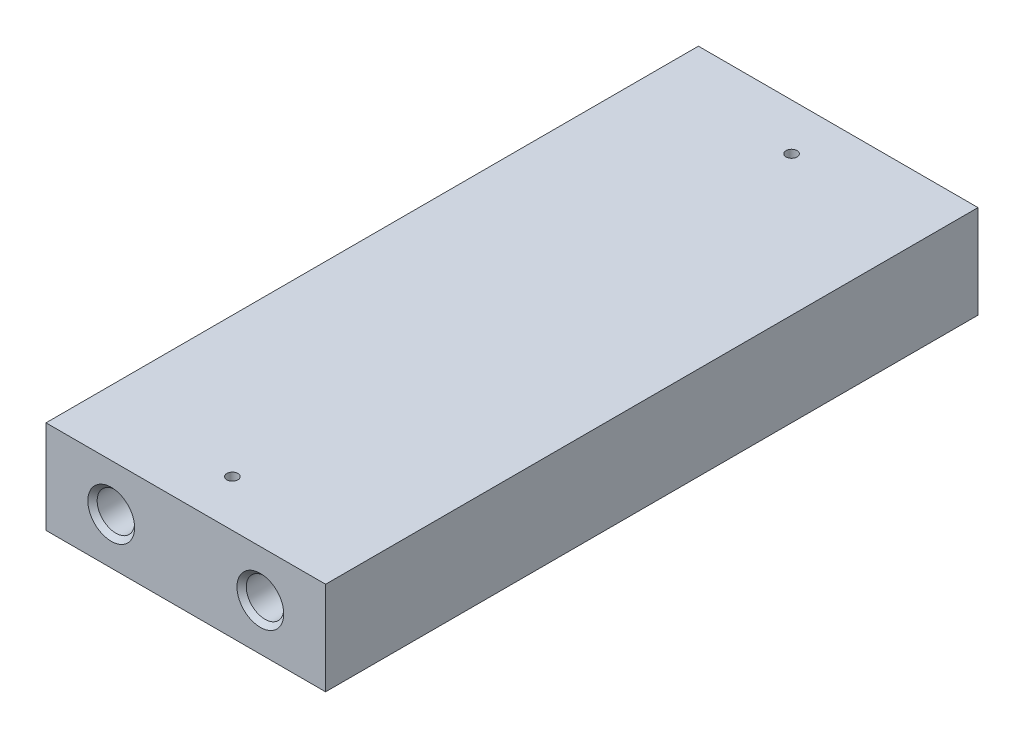
ISO-10303-21;
HEADER;
FILE_DESCRIPTION(('STEP AP214'),'2;1');
FILE_NAME('part.step','',(''),(''),'','','');
FILE_SCHEMA(('AUTOMOTIVE_DESIGN { 1 0 10303 214 1 1 1 1 }'));
ENDSEC;
DATA;
#1=APPLICATION_CONTEXT('core data for automotive mechanical design processes');
#2=APPLICATION_PROTOCOL_DEFINITION('international standard','automotive_design',2000,#1);
#3=PRODUCT_CONTEXT('',#1,'mechanical');
#4=PRODUCT('Part','Part','',(#3));
#5=PRODUCT_RELATED_PRODUCT_CATEGORY('part','',(#4));
#6=PRODUCT_DEFINITION_FORMATION('','',#4);
#7=PRODUCT_DEFINITION_CONTEXT('part definition',#1,'design');
#8=PRODUCT_DEFINITION('design','',#6,#7);
#9=PRODUCT_DEFINITION_SHAPE('','',#8);
#10=(LENGTH_UNIT() NAMED_UNIT(*) SI_UNIT(.MILLI.,.METRE.));
#11=(NAMED_UNIT(*) PLANE_ANGLE_UNIT() SI_UNIT($,.RADIAN.));
#12=(NAMED_UNIT(*) SI_UNIT($,.STERADIAN.) SOLID_ANGLE_UNIT());
#13=UNCERTAINTY_MEASURE_WITH_UNIT(LENGTH_MEASURE(1.E-05),#10,'distance_accuracy_value','');
#14=(GEOMETRIC_REPRESENTATION_CONTEXT(3) GLOBAL_UNCERTAINTY_ASSIGNED_CONTEXT((#13)) GLOBAL_UNIT_ASSIGNED_CONTEXT((#10,
#11,#12)) REPRESENTATION_CONTEXT('',''));
#15=CARTESIAN_POINT('',(0.,0.,0.));
#16=DIRECTION('',(0.,0.,1.));
#17=DIRECTION('',(1.,0.,0.));
#18=AXIS2_PLACEMENT_3D('',#15,#16,#17);
#19=CARTESIAN_POINT('',(19.05,-6.35,-88.9));
#20=DIRECTION('',(1.,0.,0.));
#21=DIRECTION('',(0.,0.,-1.));
#22=AXIS2_PLACEMENT_3D('',#19,#20,#21);
#23=PLANE('',#22);
#24=DIRECTION('',(0.,1.,0.));
#25=VECTOR('',#24,1.);
#26=CARTESIAN_POINT('',(19.05,-6.35,0.));
#27=LINE('',#26,#25);
#28=CARTESIAN_POINT('',(19.05,-6.35,0.));
#29=VERTEX_POINT('',#28);
#30=CARTESIAN_POINT('',(19.05,6.35,0.));
#31=VERTEX_POINT('',#30);
#32=EDGE_CURVE('E190',#29,#31,#27,.T.);
#33=ORIENTED_EDGE('',*,*,#32,.F.);
#34=DIRECTION('',(0.,0.,1.));
#35=VECTOR('',#34,1.);
#36=CARTESIAN_POINT('',(19.05,-6.35,-88.9));
#37=LINE('',#36,#35);
#38=CARTESIAN_POINT('',(19.05,-6.35,-88.9));
#39=VERTEX_POINT('',#38);
#40=EDGE_CURVE('E13',#39,#29,#37,.T.);
#41=ORIENTED_EDGE('',*,*,#40,.F.);
#42=DIRECTION('',(0.,1.,0.));
#43=VECTOR('',#42,1.);
#44=CARTESIAN_POINT('',(19.05,-6.35,-88.9));
#45=LINE('',#44,#43);
#46=CARTESIAN_POINT('',(19.05,6.35,-88.9));
#47=VERTEX_POINT('',#46);
#48=EDGE_CURVE('E191',#39,#47,#45,.T.);
#49=ORIENTED_EDGE('',*,*,#48,.T.);
#50=DIRECTION('',(0.,0.,1.));
#51=VECTOR('',#50,1.);
#52=CARTESIAN_POINT('',(19.05,6.35,-88.9));
#53=LINE('',#52,#51);
#54=EDGE_CURVE('E55',#47,#31,#53,.T.);
#55=ORIENTED_EDGE('',*,*,#54,.T.);
#56=EDGE_LOOP('',(#33,#41,#49,#55));
#57=FACE_BOUND('',#56,.T.);
#58=ADVANCED_FACE('F52',(#57),#23,.T.);
#59=CARTESIAN_POINT('',(-19.05,-6.35,-88.9));
#60=DIRECTION('',(0.,-1.,0.));
#61=DIRECTION('',(0.,0.,-1.));
#62=AXIS2_PLACEMENT_3D('',#59,#60,#61);
#63=PLANE('',#62);
#64=CARTESIAN_POINT('',(3.44169137633799E-12,-6.35,-82.55));
#65=DIRECTION('',(0.,1.,0.));
#66=DIRECTION('',(0.,0.,1.));
#67=AXIS2_PLACEMENT_3D('',#64,#65,#66);
#68=CIRCLE('',#67,0.755649999999997);
#69=CARTESIAN_POINT('',(3.44169137633799E-12,-6.35,-81.79435));
#70=VERTEX_POINT('',#69);
#71=EDGE_CURVE('E145',#70,#70,#68,.T.);
#72=ORIENTED_EDGE('',*,*,#71,.T.);
#73=EDGE_LOOP('',(#72));
#74=FACE_BOUND('',#73,.T.);
#75=CARTESIAN_POINT('',(3.44169137633799E-12,-6.35,-6.34999999999999));
#76=DIRECTION('',(0.,1.,0.));
#77=DIRECTION('',(0.,0.,1.));
#78=AXIS2_PLACEMENT_3D('',#75,#76,#77);
#79=CIRCLE('',#78,0.755649999999997);
#80=CARTESIAN_POINT('',(3.44169137633799E-12,-6.35,-5.59435));
#81=VERTEX_POINT('',#80);
#82=EDGE_CURVE('E151',#81,#81,#79,.T.);
#83=ORIENTED_EDGE('',*,*,#82,.T.);
#84=EDGE_LOOP('',(#83));
#85=FACE_BOUND('',#84,.T.);
#86=DIRECTION('',(1.,0.,0.));
#87=VECTOR('',#86,1.);
#88=CARTESIAN_POINT('',(-19.05,-6.35,0.));
#89=LINE('',#88,#87);
#90=CARTESIAN_POINT('',(-19.05,-6.35,0.));
#91=VERTEX_POINT('',#90);
#92=EDGE_CURVE('E194',#91,#29,#89,.T.);
#93=ORIENTED_EDGE('',*,*,#92,.F.);
#94=DIRECTION('',(0.,0.,1.));
#95=VECTOR('',#94,1.);
#96=CARTESIAN_POINT('',(-19.05,-6.35,-88.9));
#97=LINE('',#96,#95);
#98=CARTESIAN_POINT('',(-19.05,-6.35,-88.9));
#99=VERTEX_POINT('',#98);
#100=EDGE_CURVE('E61',#99,#91,#97,.T.);
#101=ORIENTED_EDGE('',*,*,#100,.F.);
#102=DIRECTION('',(1.,0.,0.));
#103=VECTOR('',#102,1.);
#104=CARTESIAN_POINT('',(-19.05,-6.35,-88.9));
#105=LINE('',#104,#103);
#106=EDGE_CURVE('E198',#99,#39,#105,.T.);
#107=ORIENTED_EDGE('',*,*,#106,.T.);
#108=ORIENTED_EDGE('',*,*,#40,.T.);
#109=EDGE_LOOP('',(#93,#101,#107,#108));
#110=FACE_BOUND('',#109,.T.);
#111=ADVANCED_FACE('F213',(#74,#85,#110),#63,.T.);
#112=CARTESIAN_POINT('',(-19.05,-6.35,-88.9));
#113=DIRECTION('',(-1.,0.,0.));
#114=DIRECTION('',(0.,0.,1.));
#115=AXIS2_PLACEMENT_3D('',#112,#113,#114);
#116=PLANE('',#115);
#117=CARTESIAN_POINT('',(-19.05,0.,-69.85));
#118=DIRECTION('',(-1.,0.,0.));
#119=DIRECTION('',(0.,0.,1.));
#120=AXIS2_PLACEMENT_3D('',#117,#118,#119);
#121=CIRCLE('',#120,3.1877);
#122=CARTESIAN_POINT('',(-19.05,0.,-66.6623));
#123=VERTEX_POINT('',#122);
#124=EDGE_CURVE('E133',#123,#123,#121,.T.);
#125=ORIENTED_EDGE('',*,*,#124,.F.);
#126=EDGE_LOOP('',(#125));
#127=FACE_BOUND('',#126,.T.);
#128=CARTESIAN_POINT('',(-19.05,0.,-19.05));
#129=DIRECTION('',(-1.,0.,0.));
#130=DIRECTION('',(0.,0.,1.));
#131=AXIS2_PLACEMENT_3D('',#128,#129,#130);
#132=CIRCLE('',#131,3.1877);
#133=CARTESIAN_POINT('',(-19.05,0.,-15.8623));
#134=VERTEX_POINT('',#133);
#135=EDGE_CURVE('E126',#134,#134,#132,.T.);
#136=ORIENTED_EDGE('',*,*,#135,.F.);
#137=EDGE_LOOP('',(#136));
#138=FACE_BOUND('',#137,.T.);
#139=DIRECTION('',(0.,-1.,0.));
#140=VECTOR('',#139,1.);
#141=CARTESIAN_POINT('',(-19.05,-6.35,0.));
#142=LINE('',#141,#140);
#143=CARTESIAN_POINT('',(-19.05,6.35,0.));
#144=VERTEX_POINT('',#143);
#145=EDGE_CURVE('E205',#144,#91,#142,.T.);
#146=ORIENTED_EDGE('',*,*,#145,.F.);
#147=DIRECTION('',(0.,0.,1.));
#148=VECTOR('',#147,1.);
#149=CARTESIAN_POINT('',(-19.05,6.35,-88.9));
#150=LINE('',#149,#148);
#151=CARTESIAN_POINT('',(-19.05,6.35,-88.9));
#152=VERTEX_POINT('',#151);
#153=EDGE_CURVE('E209',#152,#144,#150,.T.);
#154=ORIENTED_EDGE('',*,*,#153,.F.);
#155=DIRECTION('',(0.,-1.,0.));
#156=VECTOR('',#155,1.);
#157=CARTESIAN_POINT('',(-19.05,-6.35,-88.9));
#158=LINE('',#157,#156);
#159=EDGE_CURVE('E196',#152,#99,#158,.T.);
#160=ORIENTED_EDGE('',*,*,#159,.T.);
#161=ORIENTED_EDGE('',*,*,#100,.T.);
#162=EDGE_LOOP('',(#146,#154,#160,#161));
#163=FACE_BOUND('',#162,.T.);
#164=ADVANCED_FACE('F216',(#127,#138,#163),#116,.T.);
#165=CARTESIAN_POINT('',(-19.05,6.35,-88.9));
#166=DIRECTION('',(0.,1.,0.));
#167=DIRECTION('',(0.,0.,1.));
#168=AXIS2_PLACEMENT_3D('',#165,#166,#167);
#169=PLANE('',#168);
#170=CARTESIAN_POINT('',(3.44169137633799E-12,6.35,-82.55));
#171=DIRECTION('',(0.,1.,0.));
#172=DIRECTION('',(0.,0.,1.));
#173=AXIS2_PLACEMENT_3D('',#170,#171,#172);
#174=CIRCLE('',#173,0.755649999999998);
#175=CARTESIAN_POINT('',(3.44169137633799E-12,6.35,-81.79435));
#176=VERTEX_POINT('',#175);
#177=EDGE_CURVE('E142',#176,#176,#174,.T.);
#178=ORIENTED_EDGE('',*,*,#177,.F.);
#179=EDGE_LOOP('',(#178));
#180=FACE_BOUND('',#179,.T.);
#181=CARTESIAN_POINT('',(3.44169137633799E-12,6.35,-6.34999999999999));
#182=DIRECTION('',(0.,1.,0.));
#183=DIRECTION('',(0.,0.,1.));
#184=AXIS2_PLACEMENT_3D('',#181,#182,#183);
#185=CIRCLE('',#184,0.755649999999998);
#186=CARTESIAN_POINT('',(3.44169137633799E-12,6.35,-5.59435));
#187=VERTEX_POINT('',#186);
#188=EDGE_CURVE('E148',#187,#187,#185,.T.);
#189=ORIENTED_EDGE('',*,*,#188,.F.);
#190=EDGE_LOOP('',(#189));
#191=FACE_BOUND('',#190,.T.);
#192=DIRECTION('',(-1.,0.,0.));
#193=VECTOR('',#192,1.);
#194=CARTESIAN_POINT('',(-19.05,6.35,0.));
#195=LINE('',#194,#193);
#196=EDGE_CURVE('E202',#31,#144,#195,.T.);
#197=ORIENTED_EDGE('',*,*,#196,.F.);
#198=ORIENTED_EDGE('',*,*,#54,.F.);
#199=DIRECTION('',(-1.,0.,0.));
#200=VECTOR('',#199,1.);
#201=CARTESIAN_POINT('',(-19.05,6.35,-88.9));
#202=LINE('',#201,#200);
#203=EDGE_CURVE('E193',#47,#152,#202,.T.);
#204=ORIENTED_EDGE('',*,*,#203,.T.);
#205=ORIENTED_EDGE('',*,*,#153,.T.);
#206=EDGE_LOOP('',(#197,#198,#204,#205));
#207=FACE_BOUND('',#206,.T.);
#208=ADVANCED_FACE('F210',(#180,#191,#207),#169,.T.);
#209=CARTESIAN_POINT('',(0.,0.,-88.9));
#210=DIRECTION('',(0.,0.,-1.));
#211=DIRECTION('',(-1.,0.,0.));
#212=AXIS2_PLACEMENT_3D('',#209,#210,#211);
#213=PLANE('',#212);
#214=CARTESIAN_POINT('',(-10.1599999999965,0.,-88.9));
#215=DIRECTION('',(0.,0.,-1.));
#216=DIRECTION('',(-1.,0.,0.));
#217=AXIS2_PLACEMENT_3D('',#214,#215,#216);
#218=CIRCLE('',#217,3.1877);
#219=CARTESIAN_POINT('',(-13.3476999999965,0.,-88.9));
#220=VERTEX_POINT('',#219);
#221=EDGE_CURVE('E154',#220,#220,#218,.T.);
#222=ORIENTED_EDGE('',*,*,#221,.F.);
#223=EDGE_LOOP('',(#222));
#224=FACE_BOUND('',#223,.T.);
#225=CARTESIAN_POINT('',(10.1600000000035,0.,-88.9));
#226=DIRECTION('',(0.,0.,-1.));
#227=DIRECTION('',(-1.,0.,0.));
#228=AXIS2_PLACEMENT_3D('',#225,#226,#227);
#229=CIRCLE('',#228,3.1877);
#230=CARTESIAN_POINT('',(6.97230000000349,0.,-88.9));
#231=VERTEX_POINT('',#230);
#232=EDGE_CURVE('E163',#231,#231,#229,.T.);
#233=ORIENTED_EDGE('',*,*,#232,.F.);
#234=EDGE_LOOP('',(#233));
#235=FACE_BOUND('',#234,.T.);
#236=ORIENTED_EDGE('',*,*,#48,.F.);
#237=ORIENTED_EDGE('',*,*,#106,.F.);
#238=ORIENTED_EDGE('',*,*,#159,.F.);
#239=ORIENTED_EDGE('',*,*,#203,.F.);
#240=EDGE_LOOP('',(#236,#237,#238,#239));
#241=FACE_BOUND('',#240,.T.);
#242=ADVANCED_FACE('F218',(#224,#235,#241),#213,.T.);
#243=CARTESIAN_POINT('',(0.,0.,0.));
#244=DIRECTION('',(0.,0.,-1.));
#245=DIRECTION('',(-1.,0.,0.));
#246=AXIS2_PLACEMENT_3D('',#243,#244,#245);
#247=PLANE('',#246);
#248=CARTESIAN_POINT('',(-10.1599999999965,0.,0.));
#249=DIRECTION('',(0.,0.,1.));
#250=DIRECTION('',(1.,0.,0.));
#251=AXIS2_PLACEMENT_3D('',#248,#249,#250);
#252=CIRCLE('',#251,3.1877);
#253=CARTESIAN_POINT('',(-6.97229999999651,0.,0.));
#254=VERTEX_POINT('',#253);
#255=EDGE_CURVE('E172',#254,#254,#252,.T.);
#256=ORIENTED_EDGE('',*,*,#255,.F.);
#257=EDGE_LOOP('',(#256));
#258=FACE_BOUND('',#257,.T.);
#259=CARTESIAN_POINT('',(10.1600000000035,0.,0.));
#260=DIRECTION('',(0.,0.,1.));
#261=DIRECTION('',(1.,0.,0.));
#262=AXIS2_PLACEMENT_3D('',#259,#260,#261);
#263=CIRCLE('',#262,3.1877);
#264=CARTESIAN_POINT('',(13.3477000000035,0.,0.));
#265=VERTEX_POINT('',#264);
#266=EDGE_CURVE('E181',#265,#265,#263,.T.);
#267=ORIENTED_EDGE('',*,*,#266,.F.);
#268=EDGE_LOOP('',(#267));
#269=FACE_BOUND('',#268,.T.);
#270=ORIENTED_EDGE('',*,*,#32,.T.);
#271=ORIENTED_EDGE('',*,*,#196,.T.);
#272=ORIENTED_EDGE('',*,*,#145,.T.);
#273=ORIENTED_EDGE('',*,*,#92,.T.);
#274=EDGE_LOOP('',(#270,#271,#272,#273));
#275=FACE_BOUND('',#274,.T.);
#276=ADVANCED_FACE('F212',(#258,#269,#275),#247,.F.);
#277=CARTESIAN_POINT('',(10.1600000000035,0.,-12.7));
#278=DIRECTION('',(0.,0.,1.));
#279=DIRECTION('',(1.,0.,0.));
#280=AXIS2_PLACEMENT_3D('',#277,#278,#279);
#281=CONICAL_SURFACE('',#280,2.5527,1.02974425867665);
#282=CARTESIAN_POINT('',(10.1600000000035,0.,-14.2338169021917));
#283=VERTEX_POINT('',#282);
#284=VERTEX_LOOP('',#283);
#285=FACE_BOUND('',#284,.T.);
#286=CARTESIAN_POINT('',(10.1600000000035,0.,-12.7));
#287=DIRECTION('',(0.,0.,1.));
#288=DIRECTION('',(1.,0.,0.));
#289=AXIS2_PLACEMENT_3D('',#286,#287,#288);
#290=CIRCLE('',#289,2.5527);
#291=CARTESIAN_POINT('',(12.7127000000035,0.,-12.7));
#292=VERTEX_POINT('',#291);
#293=EDGE_CURVE('E187',#292,#292,#290,.T.);
#294=ORIENTED_EDGE('',*,*,#293,.T.);
#295=EDGE_LOOP('',(#294));
#296=FACE_BOUND('',#295,.T.);
#297=ADVANCED_FACE('F226',(#285,#296),#281,.F.);
#298=CARTESIAN_POINT('',(10.1600000000035,0.,0.));
#299=DIRECTION('',(0.,0.,1.));
#300=DIRECTION('',(1.,0.,0.));
#301=AXIS2_PLACEMENT_3D('',#298,#299,#300);
#302=CYLINDRICAL_SURFACE('',#301,2.5527);
#303=ORIENTED_EDGE('',*,*,#293,.F.);
#304=EDGE_LOOP('',(#303));
#305=FACE_BOUND('',#304,.T.);
#306=CARTESIAN_POINT('',(10.1600000000035,0.,-0.635000000000004));
#307=DIRECTION('',(0.,0.,1.));
#308=DIRECTION('',(1.,0.,0.));
#309=AXIS2_PLACEMENT_3D('',#306,#307,#308);
#310=CIRCLE('',#309,2.5527);
#311=CARTESIAN_POINT('',(12.7127000000035,0.,-0.635000000000004));
#312=VERTEX_POINT('',#311);
#313=EDGE_CURVE('E184',#312,#312,#310,.T.);
#314=ORIENTED_EDGE('',*,*,#313,.T.);
#315=EDGE_LOOP('',(#314));
#316=FACE_BOUND('',#315,.T.);
#317=ADVANCED_FACE('F302',(#305,#316),#302,.F.);
#318=CARTESIAN_POINT('',(10.1600000000035,0.,0.));
#319=DIRECTION('',(0.,0.,1.));
#320=DIRECTION('',(1.,0.,0.));
#321=AXIS2_PLACEMENT_3D('',#318,#319,#320);
#322=CONICAL_SURFACE('',#321,3.1877,0.785398163397446);
#323=ORIENTED_EDGE('',*,*,#313,.F.);
#324=EDGE_LOOP('',(#323));
#325=FACE_BOUND('',#324,.T.);
#326=ORIENTED_EDGE('',*,*,#266,.T.);
#327=EDGE_LOOP('',(#326));
#328=FACE_BOUND('',#327,.T.);
#329=ADVANCED_FACE('F298',(#325,#328),#322,.F.);
#330=CARTESIAN_POINT('',(-10.1599999999965,0.,-12.7));
#331=DIRECTION('',(0.,0.,1.));
#332=DIRECTION('',(1.,0.,0.));
#333=AXIS2_PLACEMENT_3D('',#330,#331,#332);
#334=CONICAL_SURFACE('',#333,2.5527,1.02974425867665);
#335=CARTESIAN_POINT('',(-10.1599999999965,0.,-14.2338169021917));
#336=VERTEX_POINT('',#335);
#337=VERTEX_LOOP('',#336);
#338=FACE_BOUND('',#337,.T.);
#339=CARTESIAN_POINT('',(-10.1599999999965,0.,-12.7));
#340=DIRECTION('',(0.,0.,1.));
#341=DIRECTION('',(1.,0.,0.));
#342=AXIS2_PLACEMENT_3D('',#339,#340,#341);
#343=CIRCLE('',#342,2.5527);
#344=CARTESIAN_POINT('',(-7.60729999999651,0.,-12.7));
#345=VERTEX_POINT('',#344);
#346=EDGE_CURVE('E178',#345,#345,#343,.T.);
#347=ORIENTED_EDGE('',*,*,#346,.T.);
#348=EDGE_LOOP('',(#347));
#349=FACE_BOUND('',#348,.T.);
#350=ADVANCED_FACE('F294',(#338,#349),#334,.F.);
#351=CARTESIAN_POINT('',(-10.1599999999965,0.,0.));
#352=DIRECTION('',(0.,0.,1.));
#353=DIRECTION('',(1.,0.,0.));
#354=AXIS2_PLACEMENT_3D('',#351,#352,#353);
#355=CYLINDRICAL_SURFACE('',#354,2.5527);
#356=ORIENTED_EDGE('',*,*,#346,.F.);
#357=EDGE_LOOP('',(#356));
#358=FACE_BOUND('',#357,.T.);
#359=CARTESIAN_POINT('',(-10.1599999999965,0.,-0.635000000000004));
#360=DIRECTION('',(0.,0.,1.));
#361=DIRECTION('',(1.,0.,0.));
#362=AXIS2_PLACEMENT_3D('',#359,#360,#361);
#363=CIRCLE('',#362,2.5527);
#364=CARTESIAN_POINT('',(-7.60729999999651,0.,-0.635000000000004));
#365=VERTEX_POINT('',#364);
#366=EDGE_CURVE('E175',#365,#365,#363,.T.);
#367=ORIENTED_EDGE('',*,*,#366,.T.);
#368=EDGE_LOOP('',(#367));
#369=FACE_BOUND('',#368,.T.);
#370=ADVANCED_FACE('F290',(#358,#369),#355,.F.);
#371=CARTESIAN_POINT('',(-10.1599999999965,0.,0.));
#372=DIRECTION('',(0.,0.,1.));
#373=DIRECTION('',(1.,0.,0.));
#374=AXIS2_PLACEMENT_3D('',#371,#372,#373);
#375=CONICAL_SURFACE('',#374,3.1877,0.785398163397446);
#376=ORIENTED_EDGE('',*,*,#366,.F.);
#377=EDGE_LOOP('',(#376));
#378=FACE_BOUND('',#377,.T.);
#379=ORIENTED_EDGE('',*,*,#255,.T.);
#380=EDGE_LOOP('',(#379));
#381=FACE_BOUND('',#380,.T.);
#382=ADVANCED_FACE('F286',(#378,#381),#375,.F.);
#383=CARTESIAN_POINT('',(10.1600000000035,0.,-76.2));
#384=DIRECTION('',(0.,0.,-1.));
#385=DIRECTION('',(-1.,0.,0.));
#386=AXIS2_PLACEMENT_3D('',#383,#384,#385);
#387=CONICAL_SURFACE('',#386,2.5527,1.02974425867665);
#388=CARTESIAN_POINT('',(10.1600000000035,0.,-74.6661830978083));
#389=VERTEX_POINT('',#388);
#390=VERTEX_LOOP('',#389);
#391=FACE_BOUND('',#390,.T.);
#392=CARTESIAN_POINT('',(10.1600000000035,0.,-76.2));
#393=DIRECTION('',(0.,0.,-1.));
#394=DIRECTION('',(-1.,0.,0.));
#395=AXIS2_PLACEMENT_3D('',#392,#393,#394);
#396=CIRCLE('',#395,2.5527);
#397=CARTESIAN_POINT('',(7.6073000000035,0.,-76.2));
#398=VERTEX_POINT('',#397);
#399=EDGE_CURVE('E169',#398,#398,#396,.T.);
#400=ORIENTED_EDGE('',*,*,#399,.T.);
#401=EDGE_LOOP('',(#400));
#402=FACE_BOUND('',#401,.T.);
#403=ADVANCED_FACE('F282',(#391,#402),#387,.F.);
#404=CARTESIAN_POINT('',(10.1600000000035,0.,-88.9));
#405=DIRECTION('',(0.,0.,-1.));
#406=DIRECTION('',(-1.,0.,0.));
#407=AXIS2_PLACEMENT_3D('',#404,#405,#406);
#408=CYLINDRICAL_SURFACE('',#407,2.5527);
#409=ORIENTED_EDGE('',*,*,#399,.F.);
#410=EDGE_LOOP('',(#409));
#411=FACE_BOUND('',#410,.T.);
#412=CARTESIAN_POINT('',(10.1600000000035,0.,-88.265));
#413=DIRECTION('',(0.,0.,-1.));
#414=DIRECTION('',(-1.,0.,0.));
#415=AXIS2_PLACEMENT_3D('',#412,#413,#414);
#416=CIRCLE('',#415,2.5527);
#417=CARTESIAN_POINT('',(7.60730000000349,0.,-88.265));
#418=VERTEX_POINT('',#417);
#419=EDGE_CURVE('E166',#418,#418,#416,.T.);
#420=ORIENTED_EDGE('',*,*,#419,.T.);
#421=EDGE_LOOP('',(#420));
#422=FACE_BOUND('',#421,.T.);
#423=ADVANCED_FACE('F278',(#411,#422),#408,.F.);
#424=CARTESIAN_POINT('',(10.1600000000035,0.,-88.9));
#425=DIRECTION('',(0.,0.,-1.));
#426=DIRECTION('',(-1.,0.,0.));
#427=AXIS2_PLACEMENT_3D('',#424,#425,#426);
#428=CONICAL_SURFACE('',#427,3.1877,0.785398163397442);
#429=ORIENTED_EDGE('',*,*,#419,.F.);
#430=EDGE_LOOP('',(#429));
#431=FACE_BOUND('',#430,.T.);
#432=ORIENTED_EDGE('',*,*,#232,.T.);
#433=EDGE_LOOP('',(#432));
#434=FACE_BOUND('',#433,.T.);
#435=ADVANCED_FACE('F274',(#431,#434),#428,.F.);
#436=CARTESIAN_POINT('',(-10.1599999999965,0.,-76.2));
#437=DIRECTION('',(0.,0.,-1.));
#438=DIRECTION('',(-1.,0.,0.));
#439=AXIS2_PLACEMENT_3D('',#436,#437,#438);
#440=CONICAL_SURFACE('',#439,2.5527,1.02974425867665);
#441=CARTESIAN_POINT('',(-10.1599999999965,0.,-74.6661830978083));
#442=VERTEX_POINT('',#441);
#443=VERTEX_LOOP('',#442);
#444=FACE_BOUND('',#443,.T.);
#445=CARTESIAN_POINT('',(-10.1599999999965,0.,-76.2));
#446=DIRECTION('',(0.,0.,-1.));
#447=DIRECTION('',(-1.,0.,0.));
#448=AXIS2_PLACEMENT_3D('',#445,#446,#447);
#449=CIRCLE('',#448,2.5527);
#450=CARTESIAN_POINT('',(-12.7126999999965,0.,-76.2));
#451=VERTEX_POINT('',#450);
#452=EDGE_CURVE('E160',#451,#451,#449,.T.);
#453=ORIENTED_EDGE('',*,*,#452,.T.);
#454=EDGE_LOOP('',(#453));
#455=FACE_BOUND('',#454,.T.);
#456=ADVANCED_FACE('F270',(#444,#455),#440,.F.);
#457=CARTESIAN_POINT('',(-10.1599999999965,0.,-88.9));
#458=DIRECTION('',(0.,0.,-1.));
#459=DIRECTION('',(-1.,0.,0.));
#460=AXIS2_PLACEMENT_3D('',#457,#458,#459);
#461=CYLINDRICAL_SURFACE('',#460,2.5527);
#462=ORIENTED_EDGE('',*,*,#452,.F.);
#463=EDGE_LOOP('',(#462));
#464=FACE_BOUND('',#463,.T.);
#465=CARTESIAN_POINT('',(-10.1599999999965,0.,-88.265));
#466=DIRECTION('',(0.,0.,-1.));
#467=DIRECTION('',(-1.,0.,0.));
#468=AXIS2_PLACEMENT_3D('',#465,#466,#467);
#469=CIRCLE('',#468,2.5527);
#470=CARTESIAN_POINT('',(-12.7126999999965,0.,-88.265));
#471=VERTEX_POINT('',#470);
#472=EDGE_CURVE('E157',#471,#471,#469,.T.);
#473=ORIENTED_EDGE('',*,*,#472,.T.);
#474=EDGE_LOOP('',(#473));
#475=FACE_BOUND('',#474,.T.);
#476=ADVANCED_FACE('F263',(#464,#475),#461,.F.);
#477=CARTESIAN_POINT('',(-10.1599999999965,0.,-88.9));
#478=DIRECTION('',(0.,0.,-1.));
#479=DIRECTION('',(-1.,0.,0.));
#480=AXIS2_PLACEMENT_3D('',#477,#478,#479);
#481=CONICAL_SURFACE('',#480,3.1877,0.785398163397442);
#482=ORIENTED_EDGE('',*,*,#472,.F.);
#483=EDGE_LOOP('',(#482));
#484=FACE_BOUND('',#483,.T.);
#485=ORIENTED_EDGE('',*,*,#221,.T.);
#486=EDGE_LOOP('',(#485));
#487=FACE_BOUND('',#486,.T.);
#488=ADVANCED_FACE('F252',(#484,#487),#481,.F.);
#489=CARTESIAN_POINT('',(3.44169137633799E-12,6.35,-6.34999999999999));
#490=DIRECTION('',(0.,1.,0.));
#491=DIRECTION('',(0.,0.,1.));
#492=AXIS2_PLACEMENT_3D('',#489,#490,#491);
#493=CYLINDRICAL_SURFACE('',#492,0.755649999999998);
#494=ORIENTED_EDGE('',*,*,#82,.F.);
#495=EDGE_LOOP('',(#494));
#496=FACE_BOUND('',#495,.T.);
#497=ORIENTED_EDGE('',*,*,#188,.T.);
#498=EDGE_LOOP('',(#497));
#499=FACE_BOUND('',#498,.T.);
#500=ADVANCED_FACE('F248',(#496,#499),#493,.F.);
#501=CARTESIAN_POINT('',(3.44169137633799E-12,6.35,-82.55));
#502=DIRECTION('',(0.,1.,0.));
#503=DIRECTION('',(0.,0.,1.));
#504=AXIS2_PLACEMENT_3D('',#501,#502,#503);
#505=CYLINDRICAL_SURFACE('',#504,0.755649999999998);
#506=ORIENTED_EDGE('',*,*,#71,.F.);
#507=EDGE_LOOP('',(#506));
#508=FACE_BOUND('',#507,.T.);
#509=ORIENTED_EDGE('',*,*,#177,.T.);
#510=EDGE_LOOP('',(#509));
#511=FACE_BOUND('',#510,.T.);
#512=ADVANCED_FACE('F251',(#508,#511),#505,.F.);
#513=CARTESIAN_POINT('',(-5.07999999999999,0.,-19.05));
#514=DIRECTION('',(-1.,0.,0.));
#515=DIRECTION('',(0.,0.,1.));
#516=AXIS2_PLACEMENT_3D('',#513,#514,#515);
#517=CONICAL_SURFACE('',#516,2.5527,1.02974425867665);
#518=CARTESIAN_POINT('',(-3.54618309780834,0.,-19.05));
#519=VERTEX_POINT('',#518);
#520=VERTEX_LOOP('',#519);
#521=FACE_BOUND('',#520,.T.);
#522=CARTESIAN_POINT('',(-5.07999999999999,0.,-19.05));
#523=DIRECTION('',(-1.,0.,0.));
#524=DIRECTION('',(0.,0.,1.));
#525=AXIS2_PLACEMENT_3D('',#522,#523,#524);
#526=CIRCLE('',#525,2.5527);
#527=CARTESIAN_POINT('',(-5.07999999999999,0.,-16.4973));
#528=VERTEX_POINT('',#527);
#529=EDGE_CURVE('E139',#528,#528,#526,.T.);
#530=ORIENTED_EDGE('',*,*,#529,.T.);
#531=EDGE_LOOP('',(#530));
#532=FACE_BOUND('',#531,.T.);
#533=ADVANCED_FACE('F260',(#521,#532),#517,.F.);
#534=CARTESIAN_POINT('',(-19.05,0.,-19.05));
#535=DIRECTION('',(-1.,0.,0.));
#536=DIRECTION('',(0.,0.,1.));
#537=AXIS2_PLACEMENT_3D('',#534,#535,#536);
#538=CYLINDRICAL_SURFACE('',#537,2.55269999999999);
#539=ORIENTED_EDGE('',*,*,#529,.F.);
#540=EDGE_LOOP('',(#539));
#541=FACE_BOUND('',#540,.T.);
#542=CARTESIAN_POINT('',(-18.415,0.,-19.05));
#543=DIRECTION('',(-1.,0.,0.));
#544=DIRECTION('',(0.,0.,1.));
#545=AXIS2_PLACEMENT_3D('',#542,#543,#544);
#546=CIRCLE('',#545,2.55269999999999);
#547=CARTESIAN_POINT('',(-18.415,0.,-16.4973));
#548=VERTEX_POINT('',#547);
#549=EDGE_CURVE('E130',#548,#548,#546,.T.);
#550=ORIENTED_EDGE('',*,*,#549,.T.);
#551=EDGE_LOOP('',(#550));
#552=FACE_BOUND('',#551,.T.);
#553=ADVANCED_FACE('F411',(#541,#552),#538,.F.);
#554=CARTESIAN_POINT('',(-19.05,0.,-19.05));
#555=DIRECTION('',(-1.,0.,0.));
#556=DIRECTION('',(0.,0.,1.));
#557=AXIS2_PLACEMENT_3D('',#554,#555,#556);
#558=CONICAL_SURFACE('',#557,3.1877,0.785398163397446);
#559=ORIENTED_EDGE('',*,*,#549,.F.);
#560=EDGE_LOOP('',(#559));
#561=FACE_BOUND('',#560,.T.);
#562=ORIENTED_EDGE('',*,*,#135,.T.);
#563=EDGE_LOOP('',(#562));
#564=FACE_BOUND('',#563,.T.);
#565=ADVANCED_FACE('F120',(#561,#564),#558,.F.);
#566=CARTESIAN_POINT('',(-5.07999999999999,0.,-69.85));
#567=DIRECTION('',(-1.,0.,0.));
#568=DIRECTION('',(0.,0.,1.));
#569=AXIS2_PLACEMENT_3D('',#566,#567,#568);
#570=CONICAL_SURFACE('',#569,2.5527,1.02974425867665);
#571=CARTESIAN_POINT('',(-3.54618309780834,0.,-69.85));
#572=VERTEX_POINT('',#571);
#573=VERTEX_LOOP('',#572);
#574=FACE_BOUND('',#573,.T.);
#575=CARTESIAN_POINT('',(-5.07999999999999,0.,-69.85));
#576=DIRECTION('',(-1.,0.,0.));
#577=DIRECTION('',(0.,0.,1.));
#578=AXIS2_PLACEMENT_3D('',#575,#576,#577);
#579=CIRCLE('',#578,2.5527);
#580=CARTESIAN_POINT('',(-5.07999999999999,0.,-67.2973));
#581=VERTEX_POINT('',#580);
#582=EDGE_CURVE('E124',#581,#581,#579,.T.);
#583=ORIENTED_EDGE('',*,*,#582,.T.);
#584=EDGE_LOOP('',(#583));
#585=FACE_BOUND('',#584,.T.);
#586=ADVANCED_FACE('F116',(#574,#585),#570,.F.);
#587=CARTESIAN_POINT('',(-19.05,0.,-69.85));
#588=DIRECTION('',(-1.,0.,0.));
#589=DIRECTION('',(0.,0.,1.));
#590=AXIS2_PLACEMENT_3D('',#587,#588,#589);
#591=CYLINDRICAL_SURFACE('',#590,2.55269999999999);
#592=ORIENTED_EDGE('',*,*,#582,.F.);
#593=EDGE_LOOP('',(#592));
#594=FACE_BOUND('',#593,.T.);
#595=CARTESIAN_POINT('',(-18.415,0.,-69.85));
#596=DIRECTION('',(-1.,0.,0.));
#597=DIRECTION('',(0.,0.,1.));
#598=AXIS2_PLACEMENT_3D('',#595,#596,#597);
#599=CIRCLE('',#598,2.55269999999999);
#600=CARTESIAN_POINT('',(-18.415,0.,-67.2973));
#601=VERTEX_POINT('',#600);
#602=EDGE_CURVE('E127',#601,#601,#599,.T.);
#603=ORIENTED_EDGE('',*,*,#602,.T.);
#604=EDGE_LOOP('',(#603));
#605=FACE_BOUND('',#604,.T.);
#606=ADVANCED_FACE('F119',(#594,#605),#591,.F.);
#607=CARTESIAN_POINT('',(-19.05,0.,-69.85));
#608=DIRECTION('',(-1.,0.,0.));
#609=DIRECTION('',(0.,0.,1.));
#610=AXIS2_PLACEMENT_3D('',#607,#608,#609);
#611=CONICAL_SURFACE('',#610,3.1877,0.785398163397446);
#612=ORIENTED_EDGE('',*,*,#602,.F.);
#613=EDGE_LOOP('',(#612));
#614=FACE_BOUND('',#613,.T.);
#615=ORIENTED_EDGE('',*,*,#124,.T.);
#616=EDGE_LOOP('',(#615));
#617=FACE_BOUND('',#616,.T.);
#618=ADVANCED_FACE('F445',(#614,#617),#611,.F.);
#619=CLOSED_SHELL('',(#58,#111,#164,#208,#242,#276,#297,#317,#329,#350,#370,#382,#403,#423,#435,
#456,#476,#488,#500,#512,#533,#553,#565,#586,#606,#618));
#620=MANIFOLD_SOLID_BREP('B2',#619);
#621=ADVANCED_BREP_SHAPE_REPRESENTATION('',(#18,#620),#14);
#622=SHAPE_DEFINITION_REPRESENTATION(#9,#621);
ENDSEC;
END-ISO-10303-21;
